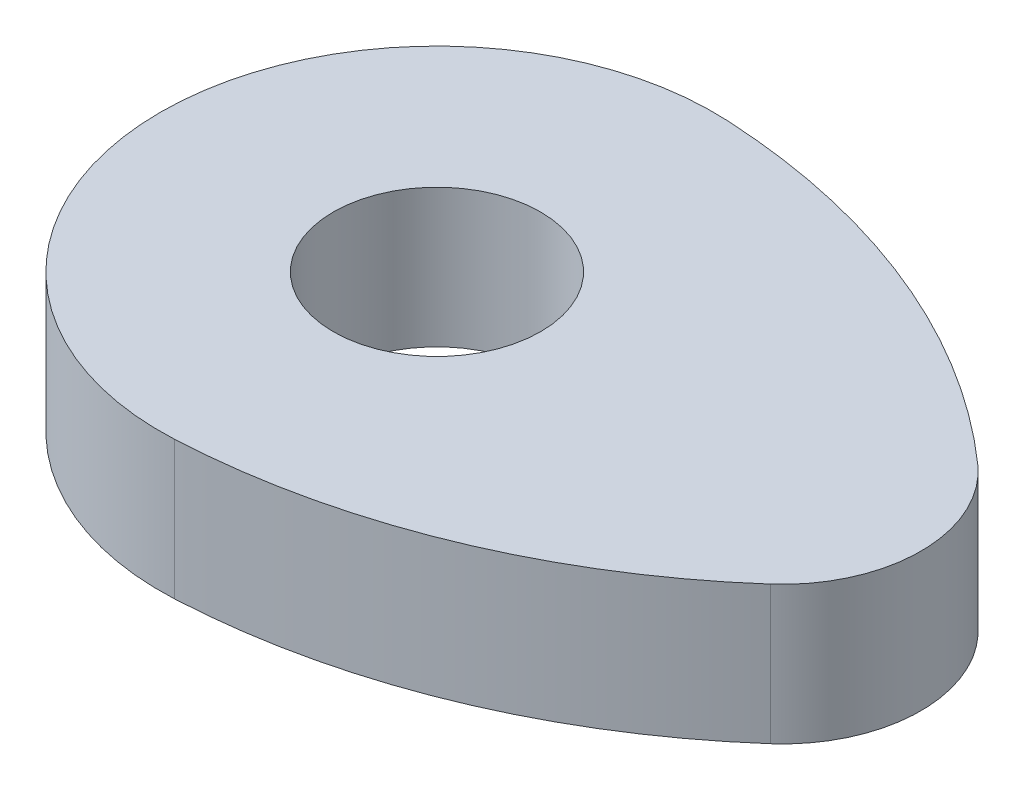
ISO-10303-21;
HEADER;
FILE_DESCRIPTION(('STEP AP214'),'2;1');
FILE_NAME('part.step','',(''),(''),'','','');
FILE_SCHEMA(('AUTOMOTIVE_DESIGN { 1 0 10303 214 1 1 1 1 }'));
ENDSEC;
DATA;
#1=APPLICATION_CONTEXT('core data for automotive mechanical design processes');
#2=APPLICATION_PROTOCOL_DEFINITION('international standard','automotive_design',2000,#1);
#3=PRODUCT_CONTEXT('',#1,'mechanical');
#4=PRODUCT('Part','Part','',(#3));
#5=PRODUCT_RELATED_PRODUCT_CATEGORY('part','',(#4));
#6=PRODUCT_DEFINITION_FORMATION('','',#4);
#7=PRODUCT_DEFINITION_CONTEXT('part definition',#1,'design');
#8=PRODUCT_DEFINITION('design','',#6,#7);
#9=PRODUCT_DEFINITION_SHAPE('','',#8);
#10=(LENGTH_UNIT() NAMED_UNIT(*) SI_UNIT(.MILLI.,.METRE.));
#11=(NAMED_UNIT(*) PLANE_ANGLE_UNIT() SI_UNIT($,.RADIAN.));
#12=(NAMED_UNIT(*) SI_UNIT($,.STERADIAN.) SOLID_ANGLE_UNIT());
#13=UNCERTAINTY_MEASURE_WITH_UNIT(LENGTH_MEASURE(1.E-05),#10,'distance_accuracy_value','');
#14=(GEOMETRIC_REPRESENTATION_CONTEXT(3) GLOBAL_UNCERTAINTY_ASSIGNED_CONTEXT((#13)) GLOBAL_UNIT_ASSIGNED_CONTEXT((#10,
#11,#12)) REPRESENTATION_CONTEXT('',''));
#15=CARTESIAN_POINT('',(0.,0.,0.));
#16=DIRECTION('',(0.,0.,1.));
#17=DIRECTION('',(1.,0.,0.));
#18=AXIS2_PLACEMENT_3D('',#15,#16,#17);
#19=CARTESIAN_POINT('',(11.75,5.,14.9812382665786));
#20=DIRECTION('',(0.,-1.,0.));
#21=DIRECTION('',(0.,0.,-1.));
#22=AXIS2_PLACEMENT_3D('',#19,#20,#21);
#23=PLANE('',#22);
#24=CARTESIAN_POINT('',(-1.5,5.,29.9624765331573));
#25=DIRECTION('',(0.,1.,0.));
#26=DIRECTION('',(0.,0.,-1.));
#27=AXIS2_PLACEMENT_3D('',#24,#25,#26);
#28=CIRCLE('',#27,50.);
#29=CARTESIAN_POINT('',(31.625,5.,-7.49061913328932));
#30=VERTEX_POINT('',#29);
#31=CARTESIAN_POINT('',(1.,5.,-19.9749843554382));
#32=VERTEX_POINT('',#31);
#33=EDGE_CURVE('E87',#30,#32,#28,.T.);
#34=ORIENTED_EDGE('',*,*,#33,.T.);
#35=CARTESIAN_POINT('',(0.,5.,0.));
#36=DIRECTION('',(0.,1.,0.));
#37=DIRECTION('',(0.,0.,1.));
#38=AXIS2_PLACEMENT_3D('',#35,#36,#37);
#39=CIRCLE('',#38,20.);
#40=CARTESIAN_POINT('',(1.00000000000001,5.,19.9749843554382));
#41=VERTEX_POINT('',#40);
#42=EDGE_CURVE('E82',#32,#41,#39,.T.);
#43=ORIENTED_EDGE('',*,*,#42,.T.);
#44=CARTESIAN_POINT('',(-1.5,5.,-29.9624765331573));
#45=DIRECTION('',(0.,1.,0.));
#46=DIRECTION('',(0.,0.,1.));
#47=AXIS2_PLACEMENT_3D('',#44,#45,#46);
#48=CIRCLE('',#47,50.);
#49=CARTESIAN_POINT('',(31.625,5.,7.49061913328933));
#50=VERTEX_POINT('',#49);
#51=EDGE_CURVE('E85',#41,#50,#48,.T.);
#52=ORIENTED_EDGE('',*,*,#51,.T.);
#53=CARTESIAN_POINT('',(25.,5.,0.));
#54=DIRECTION('',(0.,1.,0.));
#55=DIRECTION('',(0.,0.,1.));
#56=AXIS2_PLACEMENT_3D('',#53,#54,#55);
#57=CIRCLE('',#56,10.);
#58=EDGE_CURVE('E52',#50,#30,#57,.T.);
#59=ORIENTED_EDGE('',*,*,#58,.T.);
#60=EDGE_LOOP('',(#34,#43,#52,#59));
#61=FACE_BOUND('',#60,.T.);
#62=CARTESIAN_POINT('',(0.,5.,0.));
#63=DIRECTION('',(0.,1.,0.));
#64=DIRECTION('',(0.,0.,1.));
#65=AXIS2_PLACEMENT_3D('',#62,#63,#64);
#66=CIRCLE('',#65,7.5);
#67=CARTESIAN_POINT('',(0.,5.,7.5));
#68=VERTEX_POINT('',#67);
#69=EDGE_CURVE('E102',#68,#68,#66,.T.);
#70=ORIENTED_EDGE('',*,*,#69,.F.);
#71=EDGE_LOOP('',(#70));
#72=FACE_BOUND('',#71,.T.);
#73=ADVANCED_FACE('F35',(#61,#72),#23,.F.);
#74=CARTESIAN_POINT('',(11.75,-5.,14.9812382665786));
#75=DIRECTION('',(0.,-1.,0.));
#76=DIRECTION('',(0.,0.,-1.));
#77=AXIS2_PLACEMENT_3D('',#74,#75,#76);
#78=PLANE('',#77);
#79=CARTESIAN_POINT('',(-1.5,-5.,29.9624765331573));
#80=DIRECTION('',(0.,1.,0.));
#81=DIRECTION('',(0.,0.,-1.));
#82=AXIS2_PLACEMENT_3D('',#79,#80,#81);
#83=CIRCLE('',#82,50.);
#84=CARTESIAN_POINT('',(31.625,-5.,-7.49061913328932));
#85=VERTEX_POINT('',#84);
#86=CARTESIAN_POINT('',(1.,-5.,-19.9749843554382));
#87=VERTEX_POINT('',#86);
#88=EDGE_CURVE('E99',#85,#87,#83,.T.);
#89=ORIENTED_EDGE('',*,*,#88,.F.);
#90=CARTESIAN_POINT('',(25.,-5.,0.));
#91=DIRECTION('',(0.,1.,0.));
#92=DIRECTION('',(0.,0.,1.));
#93=AXIS2_PLACEMENT_3D('',#90,#91,#92);
#94=CIRCLE('',#93,10.);
#95=CARTESIAN_POINT('',(31.625,-5.,7.49061913328933));
#96=VERTEX_POINT('',#95);
#97=EDGE_CURVE('E75',#96,#85,#94,.T.);
#98=ORIENTED_EDGE('',*,*,#97,.F.);
#99=CARTESIAN_POINT('',(-1.5,-5.,-29.9624765331573));
#100=DIRECTION('',(0.,1.,0.));
#101=DIRECTION('',(0.,0.,1.));
#102=AXIS2_PLACEMENT_3D('',#99,#100,#101);
#103=CIRCLE('',#102,50.);
#104=CARTESIAN_POINT('',(1.00000000000001,-5.,19.9749843554382));
#105=VERTEX_POINT('',#104);
#106=EDGE_CURVE('E69',#105,#96,#103,.T.);
#107=ORIENTED_EDGE('',*,*,#106,.F.);
#108=CARTESIAN_POINT('',(0.,-5.,0.));
#109=DIRECTION('',(0.,1.,0.));
#110=DIRECTION('',(0.,0.,1.));
#111=AXIS2_PLACEMENT_3D('',#108,#109,#110);
#112=CIRCLE('',#111,20.);
#113=EDGE_CURVE('E91',#87,#105,#112,.T.);
#114=ORIENTED_EDGE('',*,*,#113,.F.);
#115=EDGE_LOOP('',(#89,#98,#107,#114));
#116=FACE_BOUND('',#115,.T.);
#117=CARTESIAN_POINT('',(0.,-5.,0.));
#118=DIRECTION('',(0.,1.,0.));
#119=DIRECTION('',(0.,0.,1.));
#120=AXIS2_PLACEMENT_3D('',#117,#118,#119);
#121=CIRCLE('',#120,7.5);
#122=CARTESIAN_POINT('',(0.,-5.,7.5));
#123=VERTEX_POINT('',#122);
#124=EDGE_CURVE('E114',#123,#123,#121,.T.);
#125=ORIENTED_EDGE('',*,*,#124,.T.);
#126=EDGE_LOOP('',(#125));
#127=FACE_BOUND('',#126,.T.);
#128=ADVANCED_FACE('F110',(#116,#127),#78,.T.);
#129=CARTESIAN_POINT('',(-1.5,5.,29.9624765331573));
#130=DIRECTION('',(0.,-1.,0.));
#131=DIRECTION('',(0.,0.,-1.));
#132=AXIS2_PLACEMENT_3D('',#129,#130,#131);
#133=CYLINDRICAL_SURFACE('',#132,50.);
#134=ORIENTED_EDGE('',*,*,#88,.T.);
#135=DIRECTION('',(0.,-1.,0.));
#136=VECTOR('',#135,1.);
#137=CARTESIAN_POINT('',(1.,5.,-19.9749843554382));
#138=LINE('',#137,#136);
#139=EDGE_CURVE('E11',#32,#87,#138,.T.);
#140=ORIENTED_EDGE('',*,*,#139,.F.);
#141=ORIENTED_EDGE('',*,*,#33,.F.);
#142=DIRECTION('',(0.,-1.,0.));
#143=VECTOR('',#142,1.);
#144=CARTESIAN_POINT('',(31.625,5.,-7.49061913328932));
#145=LINE('',#144,#143);
#146=EDGE_CURVE('E95',#30,#85,#145,.T.);
#147=ORIENTED_EDGE('',*,*,#146,.T.);
#148=EDGE_LOOP('',(#134,#140,#141,#147));
#149=FACE_BOUND('',#148,.T.);
#150=ADVANCED_FACE('F37',(#149),#133,.T.);
#151=CARTESIAN_POINT('',(0.,5.,0.));
#152=DIRECTION('',(0.,-1.,0.));
#153=DIRECTION('',(0.,0.,-1.));
#154=AXIS2_PLACEMENT_3D('',#151,#152,#153);
#155=CYLINDRICAL_SURFACE('',#154,20.);
#156=ORIENTED_EDGE('',*,*,#113,.T.);
#157=DIRECTION('',(0.,-1.,0.));
#158=VECTOR('',#157,1.);
#159=CARTESIAN_POINT('',(1.00000000000001,5.,19.9749843554382));
#160=LINE('',#159,#158);
#161=EDGE_CURVE('E44',#41,#105,#160,.T.);
#162=ORIENTED_EDGE('',*,*,#161,.F.);
#163=ORIENTED_EDGE('',*,*,#42,.F.);
#164=ORIENTED_EDGE('',*,*,#139,.T.);
#165=EDGE_LOOP('',(#156,#162,#163,#164));
#166=FACE_BOUND('',#165,.T.);
#167=ADVANCED_FACE('F90',(#166),#155,.T.);
#168=CARTESIAN_POINT('',(-1.5,5.,-29.9624765331573));
#169=DIRECTION('',(0.,-1.,0.));
#170=DIRECTION('',(0.,0.,-1.));
#171=AXIS2_PLACEMENT_3D('',#168,#169,#170);
#172=CYLINDRICAL_SURFACE('',#171,50.);
#173=ORIENTED_EDGE('',*,*,#106,.T.);
#174=DIRECTION('',(0.,-1.,0.));
#175=VECTOR('',#174,1.);
#176=CARTESIAN_POINT('',(31.625,5.,7.49061913328933));
#177=LINE('',#176,#175);
#178=EDGE_CURVE('E92',#50,#96,#177,.T.);
#179=ORIENTED_EDGE('',*,*,#178,.F.);
#180=ORIENTED_EDGE('',*,*,#51,.F.);
#181=ORIENTED_EDGE('',*,*,#161,.T.);
#182=EDGE_LOOP('',(#173,#179,#180,#181));
#183=FACE_BOUND('',#182,.T.);
#184=ADVANCED_FACE('F93',(#183),#172,.T.);
#185=CARTESIAN_POINT('',(25.,5.,0.));
#186=DIRECTION('',(0.,-1.,0.));
#187=DIRECTION('',(0.,0.,-1.));
#188=AXIS2_PLACEMENT_3D('',#185,#186,#187);
#189=CYLINDRICAL_SURFACE('',#188,10.);
#190=ORIENTED_EDGE('',*,*,#97,.T.);
#191=ORIENTED_EDGE('',*,*,#146,.F.);
#192=ORIENTED_EDGE('',*,*,#58,.F.);
#193=ORIENTED_EDGE('',*,*,#178,.T.);
#194=EDGE_LOOP('',(#190,#191,#192,#193));
#195=FACE_BOUND('',#194,.T.);
#196=ADVANCED_FACE('F107',(#195),#189,.T.);
#197=CARTESIAN_POINT('',(0.,5.,0.));
#198=DIRECTION('',(0.,-1.,0.));
#199=DIRECTION('',(0.,0.,-1.));
#200=AXIS2_PLACEMENT_3D('',#197,#198,#199);
#201=CYLINDRICAL_SURFACE('',#200,7.5);
#202=ORIENTED_EDGE('',*,*,#69,.T.);
#203=EDGE_LOOP('',(#202));
#204=FACE_BOUND('',#203,.T.);
#205=ORIENTED_EDGE('',*,*,#124,.F.);
#206=EDGE_LOOP('',(#205));
#207=FACE_BOUND('',#206,.T.);
#208=ADVANCED_FACE('F120',(#204,#207),#201,.F.);
#209=CLOSED_SHELL('',(#73,#128,#150,#167,#184,#196,#208));
#210=MANIFOLD_SOLID_BREP('B2',#209);
#211=ADVANCED_BREP_SHAPE_REPRESENTATION('',(#18,#210),#14);
#212=SHAPE_DEFINITION_REPRESENTATION(#9,#211);
ENDSEC;
END-ISO-10303-21;
